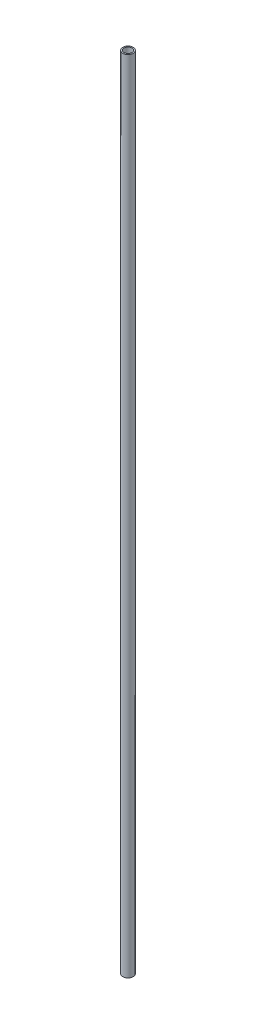
ISO-10303-21;
HEADER;
FILE_DESCRIPTION(('STEP AP214'),'2;1');
FILE_NAME('part.step','',(''),(''),'','','');
FILE_SCHEMA(('AUTOMOTIVE_DESIGN { 1 0 10303 214 1 1 1 1 }'));
ENDSEC;
DATA;
#1=APPLICATION_CONTEXT('core data for automotive mechanical design processes');
#2=APPLICATION_PROTOCOL_DEFINITION('international standard','automotive_design',2000,#1);
#3=PRODUCT_CONTEXT('',#1,'mechanical');
#4=PRODUCT('Part','Part','',(#3));
#5=PRODUCT_RELATED_PRODUCT_CATEGORY('part','',(#4));
#6=PRODUCT_DEFINITION_FORMATION('','',#4);
#7=PRODUCT_DEFINITION_CONTEXT('part definition',#1,'design');
#8=PRODUCT_DEFINITION('design','',#6,#7);
#9=PRODUCT_DEFINITION_SHAPE('','',#8);
#10=(LENGTH_UNIT() NAMED_UNIT(*) SI_UNIT(.MILLI.,.METRE.));
#11=(NAMED_UNIT(*) PLANE_ANGLE_UNIT() SI_UNIT($,.RADIAN.));
#12=(NAMED_UNIT(*) SI_UNIT($,.STERADIAN.) SOLID_ANGLE_UNIT());
#13=UNCERTAINTY_MEASURE_WITH_UNIT(LENGTH_MEASURE(1.E-05),#10,'distance_accuracy_value','');
#14=(GEOMETRIC_REPRESENTATION_CONTEXT(3) GLOBAL_UNCERTAINTY_ASSIGNED_CONTEXT((#13)) GLOBAL_UNIT_ASSIGNED_CONTEXT((#10,
#11,#12)) REPRESENTATION_CONTEXT('',''));
#15=CARTESIAN_POINT('',(0.,0.,0.));
#16=DIRECTION('',(0.,0.,1.));
#17=DIRECTION('',(1.,0.,0.));
#18=AXIS2_PLACEMENT_3D('',#15,#16,#17);
#19=CARTESIAN_POINT('',(0.,0.,0.));
#20=DIRECTION('',(0.,1.,0.));
#21=DIRECTION('',(0.,0.,1.));
#22=AXIS2_PLACEMENT_3D('',#19,#20,#21);
#23=CYLINDRICAL_SURFACE('',#22,4.);
#24=CARTESIAN_POINT('',(0.,610.,0.));
#25=DIRECTION('',(0.,1.,0.));
#26=DIRECTION('',(0.,0.,1.));
#27=AXIS2_PLACEMENT_3D('',#24,#25,#26);
#28=CIRCLE('',#27,4.);
#29=CARTESIAN_POINT('',(0.,610.,4.));
#30=VERTEX_POINT('',#29);
#31=EDGE_CURVE('E48',#30,#30,#28,.T.);
#32=ORIENTED_EDGE('',*,*,#31,.F.);
#33=EDGE_LOOP('',(#32));
#34=FACE_BOUND('',#33,.T.);
#35=CARTESIAN_POINT('',(0.,0.,0.));
#36=DIRECTION('',(0.,1.,0.));
#37=DIRECTION('',(0.,0.,1.));
#38=AXIS2_PLACEMENT_3D('',#35,#36,#37);
#39=CIRCLE('',#38,4.);
#40=CARTESIAN_POINT('',(0.,0.,4.));
#41=VERTEX_POINT('',#40);
#42=EDGE_CURVE('E33',#41,#41,#39,.T.);
#43=ORIENTED_EDGE('',*,*,#42,.T.);
#44=EDGE_LOOP('',(#43));
#45=FACE_BOUND('',#44,.T.);
#46=ADVANCED_FACE('F30',(#34,#45),#23,.T.);
#47=CARTESIAN_POINT('',(0.,0.,0.));
#48=DIRECTION('',(0.,1.,0.));
#49=DIRECTION('',(0.,0.,1.));
#50=AXIS2_PLACEMENT_3D('',#47,#48,#49);
#51=PLANE('',#50);
#52=CARTESIAN_POINT('',(0.,0.,0.));
#53=DIRECTION('',(0.,1.,0.));
#54=DIRECTION('',(0.,0.,1.));
#55=AXIS2_PLACEMENT_3D('',#52,#53,#54);
#56=CIRCLE('',#55,3.);
#57=CARTESIAN_POINT('',(0.,0.,3.));
#58=VERTEX_POINT('',#57);
#59=EDGE_CURVE('E38',#58,#58,#56,.F.);
#60=ORIENTED_EDGE('',*,*,#59,.F.);
#61=EDGE_LOOP('',(#60));
#62=FACE_BOUND('',#61,.T.);
#63=ORIENTED_EDGE('',*,*,#42,.F.);
#64=EDGE_LOOP('',(#63));
#65=FACE_BOUND('',#64,.T.);
#66=ADVANCED_FACE('F66',(#62,#65),#51,.F.);
#67=CARTESIAN_POINT('',(0.,610.,0.));
#68=DIRECTION('',(0.,1.,0.));
#69=DIRECTION('',(0.,0.,1.));
#70=AXIS2_PLACEMENT_3D('',#67,#68,#69);
#71=PLANE('',#70);
#72=CARTESIAN_POINT('',(0.,610.,0.));
#73=DIRECTION('',(0.,1.,0.));
#74=DIRECTION('',(0.,0.,1.));
#75=AXIS2_PLACEMENT_3D('',#72,#73,#74);
#76=CIRCLE('',#75,3.);
#77=CARTESIAN_POINT('',(0.,610.,3.));
#78=VERTEX_POINT('',#77);
#79=EDGE_CURVE('E11',#78,#78,#76,.F.);
#80=ORIENTED_EDGE('',*,*,#79,.T.);
#81=EDGE_LOOP('',(#80));
#82=FACE_BOUND('',#81,.T.);
#83=ORIENTED_EDGE('',*,*,#31,.T.);
#84=EDGE_LOOP('',(#83));
#85=FACE_BOUND('',#84,.T.);
#86=ADVANCED_FACE('F55',(#82,#85),#71,.T.);
#87=CARTESIAN_POINT('',(0.,0.,0.));
#88=DIRECTION('',(0.,1.,0.));
#89=DIRECTION('',(0.,0.,1.));
#90=AXIS2_PLACEMENT_3D('',#87,#88,#89);
#91=CYLINDRICAL_SURFACE('',#90,3.);
#92=ORIENTED_EDGE('',*,*,#79,.F.);
#93=EDGE_LOOP('',(#92));
#94=FACE_BOUND('',#93,.T.);
#95=ORIENTED_EDGE('',*,*,#59,.T.);
#96=EDGE_LOOP('',(#95));
#97=FACE_BOUND('',#96,.T.);
#98=ADVANCED_FACE('F58',(#94,#97),#91,.F.);
#99=CLOSED_SHELL('',(#46,#66,#86,#98));
#100=MANIFOLD_SOLID_BREP('B2',#99);
#101=ADVANCED_BREP_SHAPE_REPRESENTATION('',(#18,#100),#14);
#102=SHAPE_DEFINITION_REPRESENTATION(#9,#101);
ENDSEC;
END-ISO-10303-21;
